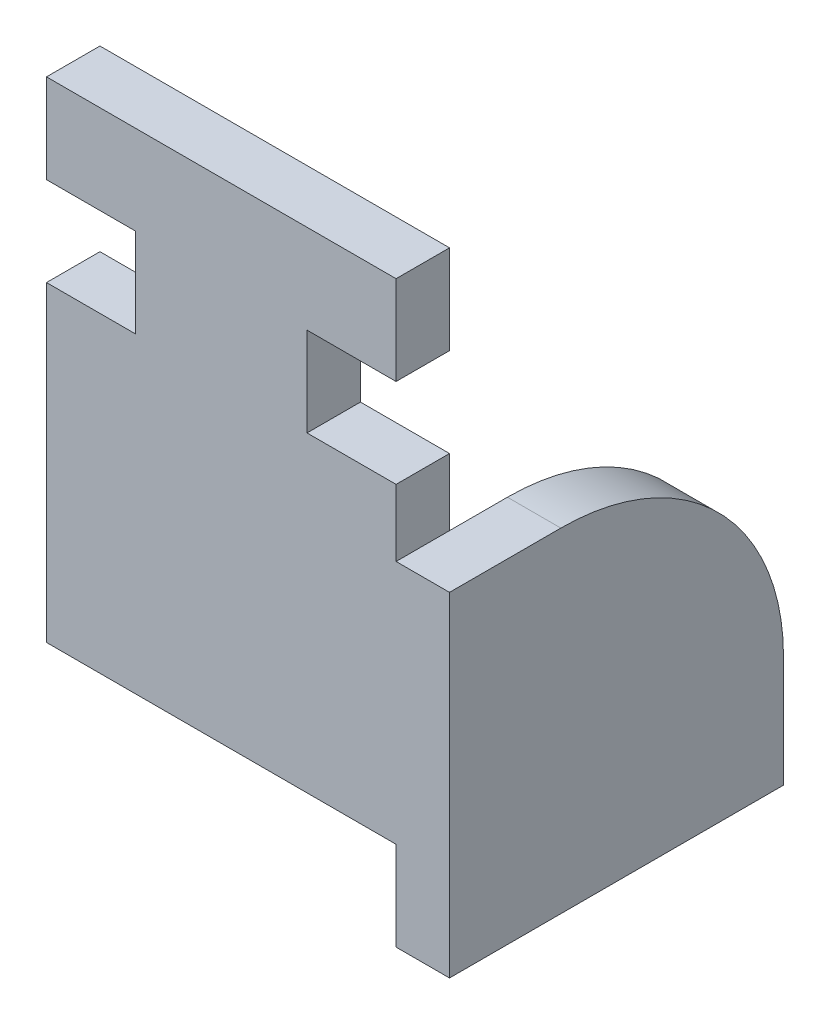
ISO-10303-21;
HEADER;
FILE_DESCRIPTION(('STEP AP214'),'2;1');
FILE_NAME('part.step','',(''),(''),'','','');
FILE_SCHEMA(('AUTOMOTIVE_DESIGN { 1 0 10303 214 1 1 1 1 }'));
ENDSEC;
DATA;
#1=APPLICATION_CONTEXT('core data for automotive mechanical design processes');
#2=APPLICATION_PROTOCOL_DEFINITION('international standard','automotive_design',2000,#1);
#3=PRODUCT_CONTEXT('',#1,'mechanical');
#4=PRODUCT('Part','Part','',(#3));
#5=PRODUCT_RELATED_PRODUCT_CATEGORY('part','',(#4));
#6=PRODUCT_DEFINITION_FORMATION('','',#4);
#7=PRODUCT_DEFINITION_CONTEXT('part definition',#1,'design');
#8=PRODUCT_DEFINITION('design','',#6,#7);
#9=PRODUCT_DEFINITION_SHAPE('','',#8);
#10=(LENGTH_UNIT() NAMED_UNIT(*) SI_UNIT(.MILLI.,.METRE.));
#11=(NAMED_UNIT(*) PLANE_ANGLE_UNIT() SI_UNIT($,.RADIAN.));
#12=(NAMED_UNIT(*) SI_UNIT($,.STERADIAN.) SOLID_ANGLE_UNIT());
#13=UNCERTAINTY_MEASURE_WITH_UNIT(LENGTH_MEASURE(1.E-05),#10,'distance_accuracy_value','');
#14=(GEOMETRIC_REPRESENTATION_CONTEXT(3) GLOBAL_UNCERTAINTY_ASSIGNED_CONTEXT((#13)) GLOBAL_UNIT_ASSIGNED_CONTEXT((#10,
#11,#12)) REPRESENTATION_CONTEXT('',''));
#15=CARTESIAN_POINT('',(0.,0.,0.));
#16=DIRECTION('',(0.,0.,1.));
#17=DIRECTION('',(1.,0.,0.));
#18=AXIS2_PLACEMENT_3D('',#15,#16,#17);
#19=CARTESIAN_POINT('',(1.57,0.,0.24));
#20=DIRECTION('',(0.,1.,0.));
#21=DIRECTION('',(-1.,0.,0.));
#22=AXIS2_PLACEMENT_3D('',#19,#20,#21);
#23=PLANE('',#22);
#24=DIRECTION('',(1.,0.,0.));
#25=VECTOR('',#24,1.);
#26=CARTESIAN_POINT('',(1.57,0.,0.));
#27=LINE('',#26,#25);
#28=CARTESIAN_POINT('',(0.,0.,0.));
#29=VERTEX_POINT('',#28);
#30=CARTESIAN_POINT('',(1.57,0.,0.));
#31=VERTEX_POINT('',#30);
#32=EDGE_CURVE('E212',#29,#31,#27,.T.);
#33=ORIENTED_EDGE('',*,*,#32,.T.);
#34=DIRECTION('',(0.,0.,-1.));
#35=VECTOR('',#34,1.);
#36=CARTESIAN_POINT('',(1.57,0.,0.24));
#37=LINE('',#36,#35);
#38=CARTESIAN_POINT('',(1.57,0.,0.24));
#39=VERTEX_POINT('',#38);
#40=EDGE_CURVE('E334',#39,#31,#37,.T.);
#41=ORIENTED_EDGE('',*,*,#40,.F.);
#42=DIRECTION('',(1.,0.,0.));
#43=VECTOR('',#42,1.);
#44=CARTESIAN_POINT('',(1.57,0.,0.24));
#45=LINE('',#44,#43);
#46=CARTESIAN_POINT('',(0.,0.,0.24));
#47=VERTEX_POINT('',#46);
#48=EDGE_CURVE('E216',#47,#39,#45,.T.);
#49=ORIENTED_EDGE('',*,*,#48,.F.);
#50=DIRECTION('',(0.,0.,-1.));
#51=VECTOR('',#50,1.);
#52=CARTESIAN_POINT('',(0.,0.,0.24));
#53=LINE('',#52,#51);
#54=EDGE_CURVE('E253',#47,#29,#53,.T.);
#55=ORIENTED_EDGE('',*,*,#54,.T.);
#56=EDGE_LOOP('',(#33,#41,#49,#55));
#57=FACE_BOUND('',#56,.T.);
#58=ADVANCED_FACE('F39',(#57),#23,.F.);
#59=CARTESIAN_POINT('',(1.57,1.4,0.24));
#60=DIRECTION('',(-1.,0.,0.));
#61=DIRECTION('',(0.,0.,1.));
#62=AXIS2_PLACEMENT_3D('',#59,#60,#61);
#63=PLANE('',#62);
#64=DIRECTION('',(0.,1.,0.));
#65=VECTOR('',#64,1.);
#66=CARTESIAN_POINT('',(1.57,1.4,0.24));
#67=LINE('',#66,#65);
#68=CARTESIAN_POINT('',(1.57,1.1,0.24));
#69=VERTEX_POINT('',#68);
#70=CARTESIAN_POINT('',(1.57,1.4,0.24));
#71=VERTEX_POINT('',#70);
#72=EDGE_CURVE('E219',#69,#71,#67,.T.);
#73=ORIENTED_EDGE('',*,*,#72,.F.);
#74=DIRECTION('',(0.,0.,-1.));
#75=VECTOR('',#74,1.);
#76=CARTESIAN_POINT('',(1.57,1.1,0.24));
#77=LINE('',#76,#75);
#78=CARTESIAN_POINT('',(1.57,1.1,0.));
#79=VERTEX_POINT('',#78);
#80=EDGE_CURVE('E171',#69,#79,#77,.T.);
#81=ORIENTED_EDGE('',*,*,#80,.T.);
#82=DIRECTION('',(0.,1.,0.));
#83=VECTOR('',#82,1.);
#84=CARTESIAN_POINT('',(1.57,1.4,0.));
#85=LINE('',#84,#83);
#86=CARTESIAN_POINT('',(1.57,1.4,0.));
#87=VERTEX_POINT('',#86);
#88=EDGE_CURVE('E257',#79,#87,#85,.T.);
#89=ORIENTED_EDGE('',*,*,#88,.T.);
#90=DIRECTION('',(0.,0.,-1.));
#91=VECTOR('',#90,1.);
#92=CARTESIAN_POINT('',(1.57,1.4,0.24));
#93=LINE('',#92,#91);
#94=EDGE_CURVE('E330',#71,#87,#93,.T.);
#95=ORIENTED_EDGE('',*,*,#94,.F.);
#96=EDGE_LOOP('',(#73,#81,#89,#95));
#97=FACE_BOUND('',#96,.T.);
#98=ADVANCED_FACE('F346',(#97),#63,.F.);
#99=CARTESIAN_POINT('',(1.17,1.4,0.24));
#100=DIRECTION('',(0.,-1.,0.));
#101=DIRECTION('',(1.,0.,0.));
#102=AXIS2_PLACEMENT_3D('',#99,#100,#101);
#103=PLANE('',#102);
#104=DIRECTION('',(-1.,0.,0.));
#105=VECTOR('',#104,1.);
#106=CARTESIAN_POINT('',(1.17,1.4,0.));
#107=LINE('',#106,#105);
#108=CARTESIAN_POINT('',(1.17,1.4,0.));
#109=VERTEX_POINT('',#108);
#110=EDGE_CURVE('E262',#87,#109,#107,.T.);
#111=ORIENTED_EDGE('',*,*,#110,.T.);
#112=DIRECTION('',(0.,0.,-1.));
#113=VECTOR('',#112,1.);
#114=CARTESIAN_POINT('',(1.17,1.4,0.24));
#115=LINE('',#114,#113);
#116=CARTESIAN_POINT('',(1.17,1.4,0.24));
#117=VERTEX_POINT('',#116);
#118=EDGE_CURVE('E326',#117,#109,#115,.T.);
#119=ORIENTED_EDGE('',*,*,#118,.F.);
#120=DIRECTION('',(-1.,0.,0.));
#121=VECTOR('',#120,1.);
#122=CARTESIAN_POINT('',(1.17,1.4,0.24));
#123=LINE('',#122,#121);
#124=EDGE_CURVE('E223',#71,#117,#123,.T.);
#125=ORIENTED_EDGE('',*,*,#124,.F.);
#126=ORIENTED_EDGE('',*,*,#94,.T.);
#127=EDGE_LOOP('',(#111,#119,#125,#126));
#128=FACE_BOUND('',#127,.T.);
#129=ADVANCED_FACE('F351',(#128),#103,.F.);
#130=CARTESIAN_POINT('',(1.17,1.8,0.24));
#131=DIRECTION('',(-1.,0.,0.));
#132=DIRECTION('',(0.,0.,1.));
#133=AXIS2_PLACEMENT_3D('',#130,#131,#132);
#134=PLANE('',#133);
#135=DIRECTION('',(0.,1.,0.));
#136=VECTOR('',#135,1.);
#137=CARTESIAN_POINT('',(1.17,1.8,0.));
#138=LINE('',#137,#136);
#139=CARTESIAN_POINT('',(1.17,1.8,0.));
#140=VERTEX_POINT('',#139);
#141=EDGE_CURVE('E265',#109,#140,#138,.T.);
#142=ORIENTED_EDGE('',*,*,#141,.T.);
#143=DIRECTION('',(0.,0.,-1.));
#144=VECTOR('',#143,1.);
#145=CARTESIAN_POINT('',(1.17,1.8,0.24));
#146=LINE('',#145,#144);
#147=CARTESIAN_POINT('',(1.17,1.8,0.24));
#148=VERTEX_POINT('',#147);
#149=EDGE_CURVE('E322',#148,#140,#146,.T.);
#150=ORIENTED_EDGE('',*,*,#149,.F.);
#151=DIRECTION('',(0.,1.,0.));
#152=VECTOR('',#151,1.);
#153=CARTESIAN_POINT('',(1.17,1.8,0.24));
#154=LINE('',#153,#152);
#155=EDGE_CURVE('E226',#117,#148,#154,.T.);
#156=ORIENTED_EDGE('',*,*,#155,.F.);
#157=ORIENTED_EDGE('',*,*,#118,.T.);
#158=EDGE_LOOP('',(#142,#150,#156,#157));
#159=FACE_BOUND('',#158,.T.);
#160=ADVANCED_FACE('F360',(#159),#134,.F.);
#161=CARTESIAN_POINT('',(1.57,1.8,0.24));
#162=DIRECTION('',(0.,1.,0.));
#163=DIRECTION('',(0.,0.,1.));
#164=AXIS2_PLACEMENT_3D('',#161,#162,#163);
#165=PLANE('',#164);
#166=DIRECTION('',(1.,0.,0.));
#167=VECTOR('',#166,1.);
#168=CARTESIAN_POINT('',(1.57,1.8,0.));
#169=LINE('',#168,#167);
#170=CARTESIAN_POINT('',(1.57,1.8,0.));
#171=VERTEX_POINT('',#170);
#172=EDGE_CURVE('E268',#140,#171,#169,.T.);
#173=ORIENTED_EDGE('',*,*,#172,.T.);
#174=DIRECTION('',(0.,0.,-1.));
#175=VECTOR('',#174,1.);
#176=CARTESIAN_POINT('',(1.57,1.8,0.24));
#177=LINE('',#176,#175);
#178=CARTESIAN_POINT('',(1.57,1.8,0.24));
#179=VERTEX_POINT('',#178);
#180=EDGE_CURVE('E318',#179,#171,#177,.T.);
#181=ORIENTED_EDGE('',*,*,#180,.F.);
#182=DIRECTION('',(1.,0.,0.));
#183=VECTOR('',#182,1.);
#184=CARTESIAN_POINT('',(1.57,1.8,0.24));
#185=LINE('',#184,#183);
#186=EDGE_CURVE('E229',#148,#179,#185,.T.);
#187=ORIENTED_EDGE('',*,*,#186,.F.);
#188=ORIENTED_EDGE('',*,*,#149,.T.);
#189=EDGE_LOOP('',(#173,#181,#187,#188));
#190=FACE_BOUND('',#189,.T.);
#191=ADVANCED_FACE('F364',(#190),#165,.F.);
#192=CARTESIAN_POINT('',(1.57,2.2,0.24));
#193=DIRECTION('',(-1.,0.,0.));
#194=DIRECTION('',(0.,0.,1.));
#195=AXIS2_PLACEMENT_3D('',#192,#193,#194);
#196=PLANE('',#195);
#197=DIRECTION('',(0.,1.,0.));
#198=VECTOR('',#197,1.);
#199=CARTESIAN_POINT('',(1.57,2.2,0.));
#200=LINE('',#199,#198);
#201=CARTESIAN_POINT('',(1.57,2.2,0.));
#202=VERTEX_POINT('',#201);
#203=EDGE_CURVE('E271',#171,#202,#200,.T.);
#204=ORIENTED_EDGE('',*,*,#203,.T.);
#205=DIRECTION('',(0.,0.,-1.));
#206=VECTOR('',#205,1.);
#207=CARTESIAN_POINT('',(1.57,2.2,0.24));
#208=LINE('',#207,#206);
#209=CARTESIAN_POINT('',(1.57,2.2,0.24));
#210=VERTEX_POINT('',#209);
#211=EDGE_CURVE('E314',#210,#202,#208,.T.);
#212=ORIENTED_EDGE('',*,*,#211,.F.);
#213=DIRECTION('',(0.,1.,0.));
#214=VECTOR('',#213,1.);
#215=CARTESIAN_POINT('',(1.57,2.2,0.24));
#216=LINE('',#215,#214);
#217=EDGE_CURVE('E232',#179,#210,#216,.T.);
#218=ORIENTED_EDGE('',*,*,#217,.F.);
#219=ORIENTED_EDGE('',*,*,#180,.T.);
#220=EDGE_LOOP('',(#204,#212,#218,#219));
#221=FACE_BOUND('',#220,.T.);
#222=ADVANCED_FACE('F371',(#221),#196,.F.);
#223=CARTESIAN_POINT('',(0.,2.2,0.24));
#224=DIRECTION('',(0.,-1.,0.));
#225=DIRECTION('',(0.,0.,-1.));
#226=AXIS2_PLACEMENT_3D('',#223,#224,#225);
#227=PLANE('',#226);
#228=DIRECTION('',(-1.,0.,0.));
#229=VECTOR('',#228,1.);
#230=CARTESIAN_POINT('',(0.,2.2,0.));
#231=LINE('',#230,#229);
#232=CARTESIAN_POINT('',(0.,2.2,0.));
#233=VERTEX_POINT('',#232);
#234=EDGE_CURVE('E274',#202,#233,#231,.T.);
#235=ORIENTED_EDGE('',*,*,#234,.T.);
#236=DIRECTION('',(0.,0.,-1.));
#237=VECTOR('',#236,1.);
#238=CARTESIAN_POINT('',(0.,2.2,0.24));
#239=LINE('',#238,#237);
#240=CARTESIAN_POINT('',(0.,2.2,0.24));
#241=VERTEX_POINT('',#240);
#242=EDGE_CURVE('E310',#241,#233,#239,.T.);
#243=ORIENTED_EDGE('',*,*,#242,.F.);
#244=DIRECTION('',(-1.,0.,0.));
#245=VECTOR('',#244,1.);
#246=CARTESIAN_POINT('',(0.,2.2,0.24));
#247=LINE('',#246,#245);
#248=EDGE_CURVE('E235',#210,#241,#247,.T.);
#249=ORIENTED_EDGE('',*,*,#248,.F.);
#250=ORIENTED_EDGE('',*,*,#211,.T.);
#251=EDGE_LOOP('',(#235,#243,#249,#250));
#252=FACE_BOUND('',#251,.T.);
#253=ADVANCED_FACE('F374',(#252),#227,.F.);
#254=CARTESIAN_POINT('',(0.,1.8,0.24));
#255=DIRECTION('',(1.,0.,0.));
#256=DIRECTION('',(0.,0.,-1.));
#257=AXIS2_PLACEMENT_3D('',#254,#255,#256);
#258=PLANE('',#257);
#259=DIRECTION('',(0.,-1.,0.));
#260=VECTOR('',#259,1.);
#261=CARTESIAN_POINT('',(0.,1.8,0.));
#262=LINE('',#261,#260);
#263=CARTESIAN_POINT('',(0.,1.8,0.));
#264=VERTEX_POINT('',#263);
#265=EDGE_CURVE('E277',#233,#264,#262,.T.);
#266=ORIENTED_EDGE('',*,*,#265,.T.);
#267=DIRECTION('',(0.,0.,-1.));
#268=VECTOR('',#267,1.);
#269=CARTESIAN_POINT('',(0.,1.8,0.24));
#270=LINE('',#269,#268);
#271=CARTESIAN_POINT('',(0.,1.8,0.24));
#272=VERTEX_POINT('',#271);
#273=EDGE_CURVE('E306',#272,#264,#270,.T.);
#274=ORIENTED_EDGE('',*,*,#273,.F.);
#275=DIRECTION('',(0.,-1.,0.));
#276=VECTOR('',#275,1.);
#277=CARTESIAN_POINT('',(0.,1.8,0.24));
#278=LINE('',#277,#276);
#279=EDGE_CURVE('E238',#241,#272,#278,.T.);
#280=ORIENTED_EDGE('',*,*,#279,.F.);
#281=ORIENTED_EDGE('',*,*,#242,.T.);
#282=EDGE_LOOP('',(#266,#274,#280,#281));
#283=FACE_BOUND('',#282,.T.);
#284=ADVANCED_FACE('F379',(#283),#258,.F.);
#285=CARTESIAN_POINT('',(0.4,1.8,0.24));
#286=DIRECTION('',(0.,1.,0.));
#287=DIRECTION('',(0.,0.,1.));
#288=AXIS2_PLACEMENT_3D('',#285,#286,#287);
#289=PLANE('',#288);
#290=DIRECTION('',(1.,0.,0.));
#291=VECTOR('',#290,1.);
#292=CARTESIAN_POINT('',(0.4,1.8,0.));
#293=LINE('',#292,#291);
#294=CARTESIAN_POINT('',(0.4,1.8,0.));
#295=VERTEX_POINT('',#294);
#296=EDGE_CURVE('E280',#264,#295,#293,.T.);
#297=ORIENTED_EDGE('',*,*,#296,.T.);
#298=DIRECTION('',(0.,0.,-1.));
#299=VECTOR('',#298,1.);
#300=CARTESIAN_POINT('',(0.4,1.8,0.24));
#301=LINE('',#300,#299);
#302=CARTESIAN_POINT('',(0.4,1.8,0.24));
#303=VERTEX_POINT('',#302);
#304=EDGE_CURVE('E302',#303,#295,#301,.T.);
#305=ORIENTED_EDGE('',*,*,#304,.F.);
#306=DIRECTION('',(1.,0.,0.));
#307=VECTOR('',#306,1.);
#308=CARTESIAN_POINT('',(0.4,1.8,0.24));
#309=LINE('',#308,#307);
#310=EDGE_CURVE('E241',#272,#303,#309,.T.);
#311=ORIENTED_EDGE('',*,*,#310,.F.);
#312=ORIENTED_EDGE('',*,*,#273,.T.);
#313=EDGE_LOOP('',(#297,#305,#311,#312));
#314=FACE_BOUND('',#313,.T.);
#315=ADVANCED_FACE('F385',(#314),#289,.F.);
#316=CARTESIAN_POINT('',(0.4,1.4,0.24));
#317=DIRECTION('',(1.,0.,0.));
#318=DIRECTION('',(0.,1.,0.));
#319=AXIS2_PLACEMENT_3D('',#316,#317,#318);
#320=PLANE('',#319);
#321=DIRECTION('',(0.,-1.,0.));
#322=VECTOR('',#321,1.);
#323=CARTESIAN_POINT('',(0.4,1.4,0.));
#324=LINE('',#323,#322);
#325=CARTESIAN_POINT('',(0.4,1.4,0.));
#326=VERTEX_POINT('',#325);
#327=EDGE_CURVE('E283',#295,#326,#324,.T.);
#328=ORIENTED_EDGE('',*,*,#327,.T.);
#329=DIRECTION('',(0.,0.,-1.));
#330=VECTOR('',#329,1.);
#331=CARTESIAN_POINT('',(0.4,1.4,0.24));
#332=LINE('',#331,#330);
#333=CARTESIAN_POINT('',(0.4,1.4,0.24));
#334=VERTEX_POINT('',#333);
#335=EDGE_CURVE('E298',#334,#326,#332,.T.);
#336=ORIENTED_EDGE('',*,*,#335,.F.);
#337=DIRECTION('',(0.,-1.,0.));
#338=VECTOR('',#337,1.);
#339=CARTESIAN_POINT('',(0.4,1.4,0.24));
#340=LINE('',#339,#338);
#341=EDGE_CURVE('E244',#303,#334,#340,.T.);
#342=ORIENTED_EDGE('',*,*,#341,.F.);
#343=ORIENTED_EDGE('',*,*,#304,.T.);
#344=EDGE_LOOP('',(#328,#336,#342,#343));
#345=FACE_BOUND('',#344,.T.);
#346=ADVANCED_FACE('F389',(#345),#320,.F.);
#347=CARTESIAN_POINT('',(0.,1.4,0.24));
#348=DIRECTION('',(0.,-1.,0.));
#349=DIRECTION('',(0.,0.,-1.));
#350=AXIS2_PLACEMENT_3D('',#347,#348,#349);
#351=PLANE('',#350);
#352=DIRECTION('',(-1.,0.,0.));
#353=VECTOR('',#352,1.);
#354=CARTESIAN_POINT('',(0.,1.4,0.));
#355=LINE('',#354,#353);
#356=CARTESIAN_POINT('',(0.,1.4,0.));
#357=VERTEX_POINT('',#356);
#358=EDGE_CURVE('E286',#326,#357,#355,.T.);
#359=ORIENTED_EDGE('',*,*,#358,.T.);
#360=DIRECTION('',(0.,0.,-1.));
#361=VECTOR('',#360,1.);
#362=CARTESIAN_POINT('',(0.,1.4,0.24));
#363=LINE('',#362,#361);
#364=CARTESIAN_POINT('',(0.,1.4,0.24));
#365=VERTEX_POINT('',#364);
#366=EDGE_CURVE('E294',#365,#357,#363,.T.);
#367=ORIENTED_EDGE('',*,*,#366,.F.);
#368=DIRECTION('',(-1.,0.,0.));
#369=VECTOR('',#368,1.);
#370=CARTESIAN_POINT('',(0.,1.4,0.24));
#371=LINE('',#370,#369);
#372=EDGE_CURVE('E247',#334,#365,#371,.T.);
#373=ORIENTED_EDGE('',*,*,#372,.F.);
#374=ORIENTED_EDGE('',*,*,#335,.T.);
#375=EDGE_LOOP('',(#359,#367,#373,#374));
#376=FACE_BOUND('',#375,.T.);
#377=ADVANCED_FACE('F394',(#376),#351,.F.);
#378=CARTESIAN_POINT('',(0.,0.,0.24));
#379=DIRECTION('',(1.,0.,0.));
#380=DIRECTION('',(0.,0.,-1.));
#381=AXIS2_PLACEMENT_3D('',#378,#379,#380);
#382=PLANE('',#381);
#383=DIRECTION('',(0.,-1.,0.));
#384=VECTOR('',#383,1.);
#385=CARTESIAN_POINT('',(0.,0.,0.));
#386=LINE('',#385,#384);
#387=EDGE_CURVE('E220',#357,#29,#386,.T.);
#388=ORIENTED_EDGE('',*,*,#387,.T.);
#389=ORIENTED_EDGE('',*,*,#54,.F.);
#390=DIRECTION('',(0.,-1.,0.));
#391=VECTOR('',#390,1.);
#392=CARTESIAN_POINT('',(0.,0.,0.24));
#393=LINE('',#392,#391);
#394=EDGE_CURVE('E250',#365,#47,#393,.T.);
#395=ORIENTED_EDGE('',*,*,#394,.F.);
#396=ORIENTED_EDGE('',*,*,#366,.T.);
#397=EDGE_LOOP('',(#388,#389,#395,#396));
#398=FACE_BOUND('',#397,.T.);
#399=ADVANCED_FACE('F400',(#398),#382,.F.);
#400=CARTESIAN_POINT('',(0.,0.,0.24));
#401=DIRECTION('',(0.,0.,-1.));
#402=DIRECTION('',(-1.,0.,0.));
#403=AXIS2_PLACEMENT_3D('',#400,#401,#402);
#404=PLANE('',#403);
#405=ORIENTED_EDGE('',*,*,#48,.T.);
#406=DIRECTION('',(0.,1.,0.));
#407=VECTOR('',#406,1.);
#408=CARTESIAN_POINT('',(1.57,-0.4,0.24));
#409=LINE('',#408,#407);
#410=CARTESIAN_POINT('',(1.57,-0.4,0.24));
#411=VERTEX_POINT('',#410);
#412=EDGE_CURVE('E201',#411,#39,#409,.T.);
#413=ORIENTED_EDGE('',*,*,#412,.F.);
#414=DIRECTION('',(-1.,0.,0.));
#415=VECTOR('',#414,1.);
#416=CARTESIAN_POINT('',(1.81,-0.4,0.24));
#417=LINE('',#416,#415);
#418=CARTESIAN_POINT('',(1.81,-0.4,0.24));
#419=VERTEX_POINT('',#418);
#420=EDGE_CURVE('E188',#419,#411,#417,.T.);
#421=ORIENTED_EDGE('',*,*,#420,.F.);
#422=DIRECTION('',(0.,1.,0.));
#423=VECTOR('',#422,1.);
#424=CARTESIAN_POINT('',(1.81,-0.4,0.24));
#425=LINE('',#424,#423);
#426=CARTESIAN_POINT('',(1.81,1.1,0.24));
#427=VERTEX_POINT('',#426);
#428=EDGE_CURVE('E181',#419,#427,#425,.T.);
#429=ORIENTED_EDGE('',*,*,#428,.T.);
#430=DIRECTION('',(-1.,0.,0.));
#431=VECTOR('',#430,1.);
#432=CARTESIAN_POINT('',(1.81,1.1,0.24));
#433=LINE('',#432,#431);
#434=EDGE_CURVE('E163',#427,#69,#433,.T.);
#435=ORIENTED_EDGE('',*,*,#434,.T.);
#436=ORIENTED_EDGE('',*,*,#72,.T.);
#437=ORIENTED_EDGE('',*,*,#124,.T.);
#438=ORIENTED_EDGE('',*,*,#155,.T.);
#439=ORIENTED_EDGE('',*,*,#186,.T.);
#440=ORIENTED_EDGE('',*,*,#217,.T.);
#441=ORIENTED_EDGE('',*,*,#248,.T.);
#442=ORIENTED_EDGE('',*,*,#279,.T.);
#443=ORIENTED_EDGE('',*,*,#310,.T.);
#444=ORIENTED_EDGE('',*,*,#341,.T.);
#445=ORIENTED_EDGE('',*,*,#372,.T.);
#446=ORIENTED_EDGE('',*,*,#394,.T.);
#447=EDGE_LOOP('',(#405,#413,#421,#429,#435,#436,#437,#438,#439,#440,#441,#442,#443,#444,#445,#446));
#448=FACE_BOUND('',#447,.T.);
#449=ADVANCED_FACE('F186',(#448),#404,.F.);
#450=CARTESIAN_POINT('',(0.,0.,0.));
#451=DIRECTION('',(0.,0.,-1.));
#452=DIRECTION('',(-1.,0.,0.));
#453=AXIS2_PLACEMENT_3D('',#450,#451,#452);
#454=PLANE('',#453);
#455=ORIENTED_EDGE('',*,*,#32,.F.);
#456=ORIENTED_EDGE('',*,*,#387,.F.);
#457=ORIENTED_EDGE('',*,*,#358,.F.);
#458=ORIENTED_EDGE('',*,*,#327,.F.);
#459=ORIENTED_EDGE('',*,*,#296,.F.);
#460=ORIENTED_EDGE('',*,*,#265,.F.);
#461=ORIENTED_EDGE('',*,*,#234,.F.);
#462=ORIENTED_EDGE('',*,*,#203,.F.);
#463=ORIENTED_EDGE('',*,*,#172,.F.);
#464=ORIENTED_EDGE('',*,*,#141,.F.);
#465=ORIENTED_EDGE('',*,*,#110,.F.);
#466=ORIENTED_EDGE('',*,*,#88,.F.);
#467=EDGE_CURVE('E258',#31,#79,#85,.T.);
#468=ORIENTED_EDGE('',*,*,#467,.F.);
#469=EDGE_LOOP('',(#455,#456,#457,#458,#459,#460,#461,#462,#463,#464,#465,#466,#468));
#470=FACE_BOUND('',#469,.T.);
#471=ADVANCED_FACE('F355',(#470),#454,.T.);
#472=CARTESIAN_POINT('',(1.57,0.,0.));
#473=DIRECTION('',(-1.,0.,0.));
#474=DIRECTION('',(0.,0.,1.));
#475=AXIS2_PLACEMENT_3D('',#472,#473,#474);
#476=PLANE('',#475);
#477=CARTESIAN_POINT('',(1.57,1.1,-0.26));
#478=VERTEX_POINT('',#477);
#479=EDGE_CURVE('E205',#79,#478,#77,.T.);
#480=ORIENTED_EDGE('',*,*,#479,.T.);
#481=CARTESIAN_POINT('',(1.57,0.1,-0.26));
#482=DIRECTION('',(-1.,0.,0.));
#483=DIRECTION('',(0.,0.,1.));
#484=AXIS2_PLACEMENT_3D('',#481,#482,#483);
#485=CIRCLE('',#484,1.);
#486=CARTESIAN_POINT('',(1.57,0.1,-1.26));
#487=VERTEX_POINT('',#486);
#488=EDGE_CURVE('E62',#478,#487,#485,.T.);
#489=ORIENTED_EDGE('',*,*,#488,.T.);
#490=DIRECTION('',(0.,1.,0.));
#491=VECTOR('',#490,1.);
#492=CARTESIAN_POINT('',(1.57,-0.4,-1.26));
#493=LINE('',#492,#491);
#494=CARTESIAN_POINT('',(1.57,-0.4,-1.26));
#495=VERTEX_POINT('',#494);
#496=EDGE_CURVE('E194',#495,#487,#493,.T.);
#497=ORIENTED_EDGE('',*,*,#496,.F.);
#498=DIRECTION('',(0.,0.,-1.));
#499=VECTOR('',#498,1.);
#500=CARTESIAN_POINT('',(1.57,-0.4,0.24));
#501=LINE('',#500,#499);
#502=EDGE_CURVE('E191',#411,#495,#501,.T.);
#503=ORIENTED_EDGE('',*,*,#502,.F.);
#504=ORIENTED_EDGE('',*,*,#412,.T.);
#505=ORIENTED_EDGE('',*,*,#40,.T.);
#506=ORIENTED_EDGE('',*,*,#467,.T.);
#507=EDGE_LOOP('',(#480,#489,#497,#503,#504,#505,#506));
#508=FACE_BOUND('',#507,.T.);
#509=ADVANCED_FACE('F404',(#508),#476,.T.);
#510=CARTESIAN_POINT('',(1.81,-0.4,0.24));
#511=DIRECTION('',(0.,1.,0.));
#512=DIRECTION('',(0.,0.,1.));
#513=AXIS2_PLACEMENT_3D('',#510,#511,#512);
#514=PLANE('',#513);
#515=ORIENTED_EDGE('',*,*,#502,.T.);
#516=DIRECTION('',(-1.,0.,0.));
#517=VECTOR('',#516,1.);
#518=CARTESIAN_POINT('',(1.81,-0.4,-1.26));
#519=LINE('',#518,#517);
#520=CARTESIAN_POINT('',(1.81,-0.4,-1.26));
#521=VERTEX_POINT('',#520);
#522=EDGE_CURVE('E175',#521,#495,#519,.T.);
#523=ORIENTED_EDGE('',*,*,#522,.F.);
#524=DIRECTION('',(0.,0.,-1.));
#525=VECTOR('',#524,1.);
#526=CARTESIAN_POINT('',(1.81,-0.4,0.24));
#527=LINE('',#526,#525);
#528=EDGE_CURVE('E176',#419,#521,#527,.T.);
#529=ORIENTED_EDGE('',*,*,#528,.F.);
#530=ORIENTED_EDGE('',*,*,#420,.T.);
#531=EDGE_LOOP('',(#515,#523,#529,#530));
#532=FACE_BOUND('',#531,.T.);
#533=ADVANCED_FACE('F407',(#532),#514,.F.);
#534=CARTESIAN_POINT('',(1.81,-0.4,-1.26));
#535=DIRECTION('',(0.,0.,1.));
#536=DIRECTION('',(1.,0.,0.));
#537=AXIS2_PLACEMENT_3D('',#534,#535,#536);
#538=PLANE('',#537);
#539=ORIENTED_EDGE('',*,*,#496,.T.);
#540=DIRECTION('',(-1.,0.,0.));
#541=VECTOR('',#540,1.);
#542=CARTESIAN_POINT('',(1.81,0.1,-1.26));
#543=LINE('',#542,#541);
#544=CARTESIAN_POINT('',(1.81,0.1,-1.26));
#545=VERTEX_POINT('',#544);
#546=EDGE_CURVE('E48',#487,#545,#543,.F.);
#547=ORIENTED_EDGE('',*,*,#546,.T.);
#548=DIRECTION('',(0.,1.,0.));
#549=VECTOR('',#548,1.);
#550=CARTESIAN_POINT('',(1.81,-0.4,-1.26));
#551=LINE('',#550,#549);
#552=EDGE_CURVE('E184',#521,#545,#551,.T.);
#553=ORIENTED_EDGE('',*,*,#552,.F.);
#554=ORIENTED_EDGE('',*,*,#522,.T.);
#555=EDGE_LOOP('',(#539,#547,#553,#554));
#556=FACE_BOUND('',#555,.T.);
#557=ADVANCED_FACE('F408',(#556),#538,.F.);
#558=CARTESIAN_POINT('',(1.81,1.1,0.24));
#559=DIRECTION('',(0.,1.,0.));
#560=DIRECTION('',(0.,0.,1.));
#561=AXIS2_PLACEMENT_3D('',#558,#559,#560);
#562=PLANE('',#561);
#563=DIRECTION('',(0.,0.,-1.));
#564=VECTOR('',#563,1.);
#565=CARTESIAN_POINT('',(1.81,1.1,0.24));
#566=LINE('',#565,#564);
#567=CARTESIAN_POINT('',(1.81,1.1,-0.26));
#568=VERTEX_POINT('',#567);
#569=EDGE_CURVE('E167',#427,#568,#566,.T.);
#570=ORIENTED_EDGE('',*,*,#569,.T.);
#571=DIRECTION('',(-1.,0.,0.));
#572=VECTOR('',#571,1.);
#573=CARTESIAN_POINT('',(1.57,1.1,-0.26));
#574=LINE('',#573,#572);
#575=EDGE_CURVE('E338',#568,#478,#574,.T.);
#576=ORIENTED_EDGE('',*,*,#575,.T.);
#577=ORIENTED_EDGE('',*,*,#479,.F.);
#578=ORIENTED_EDGE('',*,*,#80,.F.);
#579=ORIENTED_EDGE('',*,*,#434,.F.);
#580=EDGE_LOOP('',(#570,#576,#577,#578,#579));
#581=FACE_BOUND('',#580,.T.);
#582=ADVANCED_FACE('F165',(#581),#562,.T.);
#583=CARTESIAN_POINT('',(1.81,0.,0.));
#584=DIRECTION('',(-1.,0.,0.));
#585=DIRECTION('',(0.,0.,1.));
#586=AXIS2_PLACEMENT_3D('',#583,#584,#585);
#587=PLANE('',#586);
#588=ORIENTED_EDGE('',*,*,#552,.T.);
#589=CARTESIAN_POINT('',(1.81,0.1,-0.26));
#590=DIRECTION('',(-1.,0.,0.));
#591=DIRECTION('',(0.,0.,1.));
#592=AXIS2_PLACEMENT_3D('',#589,#590,#591);
#593=CIRCLE('',#592,1.);
#594=EDGE_CURVE('E11',#545,#568,#593,.F.);
#595=ORIENTED_EDGE('',*,*,#594,.T.);
#596=ORIENTED_EDGE('',*,*,#569,.F.);
#597=ORIENTED_EDGE('',*,*,#428,.F.);
#598=ORIENTED_EDGE('',*,*,#528,.T.);
#599=EDGE_LOOP('',(#588,#595,#596,#597,#598));
#600=FACE_BOUND('',#599,.T.);
#601=ADVANCED_FACE('F180',(#600),#587,.F.);
#602=CARTESIAN_POINT('',(1.81,0.1,-0.26));
#603=DIRECTION('',(1.,0.,0.));
#604=DIRECTION('',(0.,0.,-1.));
#605=AXIS2_PLACEMENT_3D('',#602,#603,#604);
#606=CYLINDRICAL_SURFACE('',#605,1.);
#607=ORIENTED_EDGE('',*,*,#594,.F.);
#608=ORIENTED_EDGE('',*,*,#546,.F.);
#609=ORIENTED_EDGE('',*,*,#488,.F.);
#610=ORIENTED_EDGE('',*,*,#575,.F.);
#611=EDGE_LOOP('',(#607,#608,#609,#610));
#612=FACE_BOUND('',#611,.T.);
#613=ADVANCED_FACE('F41',(#612),#606,.T.);
#614=CLOSED_SHELL('',(#58,#98,#129,#160,#191,#222,#253,#284,#315,#346,#377,#399,#449,#471,#509,
#533,#557,#582,#601,#613));
#615=MANIFOLD_SOLID_BREP('B2',#614);
#616=ADVANCED_BREP_SHAPE_REPRESENTATION('',(#18,#615),#14);
#617=SHAPE_DEFINITION_REPRESENTATION(#9,#616);
ENDSEC;
END-ISO-10303-21;
